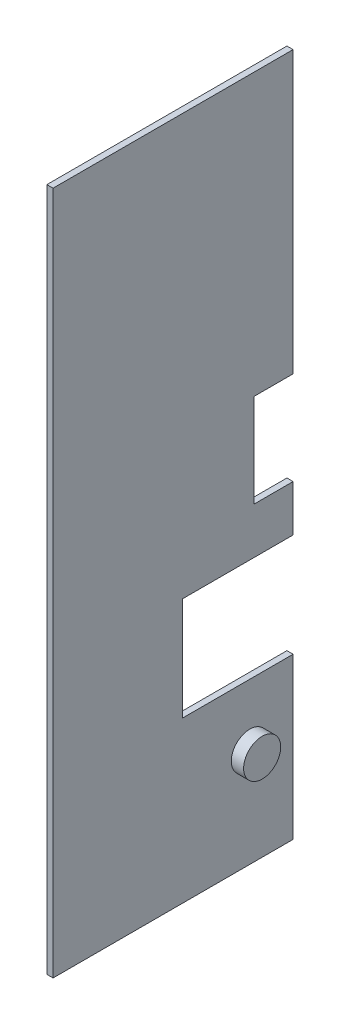
ISO-10303-21;
HEADER;
FILE_DESCRIPTION(('STEP AP214'),'2;1');
FILE_NAME('part.step','',(''),(''),'','','');
FILE_SCHEMA(('AUTOMOTIVE_DESIGN { 1 0 10303 214 1 1 1 1 }'));
ENDSEC;
DATA;
#1=APPLICATION_CONTEXT('core data for automotive mechanical design processes');
#2=APPLICATION_PROTOCOL_DEFINITION('international standard','automotive_design',2000,#1);
#3=PRODUCT_CONTEXT('',#1,'mechanical');
#4=PRODUCT('Part','Part','',(#3));
#5=PRODUCT_RELATED_PRODUCT_CATEGORY('part','',(#4));
#6=PRODUCT_DEFINITION_FORMATION('','',#4);
#7=PRODUCT_DEFINITION_CONTEXT('part definition',#1,'design');
#8=PRODUCT_DEFINITION('design','',#6,#7);
#9=PRODUCT_DEFINITION_SHAPE('','',#8);
#10=(LENGTH_UNIT() NAMED_UNIT(*) SI_UNIT(.MILLI.,.METRE.));
#11=(NAMED_UNIT(*) PLANE_ANGLE_UNIT() SI_UNIT($,.RADIAN.));
#12=(NAMED_UNIT(*) SI_UNIT($,.STERADIAN.) SOLID_ANGLE_UNIT());
#13=UNCERTAINTY_MEASURE_WITH_UNIT(LENGTH_MEASURE(1.E-05),#10,'distance_accuracy_value','');
#14=(GEOMETRIC_REPRESENTATION_CONTEXT(3) GLOBAL_UNCERTAINTY_ASSIGNED_CONTEXT((#13)) GLOBAL_UNIT_ASSIGNED_CONTEXT((#10,
#11,#12)) REPRESENTATION_CONTEXT('',''));
#15=CARTESIAN_POINT('',(0.,0.,0.));
#16=DIRECTION('',(0.,0.,1.));
#17=DIRECTION('',(1.,0.,0.));
#18=AXIS2_PLACEMENT_3D('',#15,#16,#17);
#19=CARTESIAN_POINT('',(1.,0.,0.));
#20=DIRECTION('',(-1.,0.,0.));
#21=DIRECTION('',(0.,0.,1.));
#22=AXIS2_PLACEMENT_3D('',#19,#20,#21);
#23=PLANE('',#22);
#24=CARTESIAN_POINT('',(1.,6.10997262878797,10.4104146753078));
#25=DIRECTION('',(-1.,0.,0.));
#26=DIRECTION('',(0.,0.,1.));
#27=AXIS2_PLACEMENT_3D('',#24,#25,#26);
#28=CIRCLE('',#27,1.37973862307829);
#29=CARTESIAN_POINT('',(1.,6.10997262878797,11.7901532983861));
#30=VERTEX_POINT('',#29);
#31=EDGE_CURVE('E139',#30,#30,#28,.T.);
#32=ORIENTED_EDGE('',*,*,#31,.T.);
#33=EDGE_LOOP('',(#32));
#34=FACE_BOUND('',#33,.T.);
#35=CARTESIAN_POINT('',(1.,6.10997262878797,10.4104146753078));
#36=DIRECTION('',(1.,0.,0.));
#37=DIRECTION('',(0.,0.,-1.));
#38=AXIS2_PLACEMENT_3D('',#35,#36,#37);
#39=CIRCLE('',#38,2.27350306586522);
#40=CARTESIAN_POINT('',(1.,6.10997262878797,8.1369116094426));
#41=VERTEX_POINT('',#40);
#42=EDGE_CURVE('E294',#41,#41,#39,.T.);
#43=ORIENTED_EDGE('',*,*,#42,.T.);
#44=EDGE_LOOP('',(#43));
#45=FACE_BOUND('',#44,.T.);
#46=ADVANCED_FACE('F33',(#34,#45),#23,.F.);
#47=CARTESIAN_POINT('',(1.,100.85,3.40000000000002));
#48=DIRECTION('',(0.,0.,-1.));
#49=DIRECTION('',(0.,1.,0.));
#50=AXIS2_PLACEMENT_3D('',#47,#48,#49);
#51=PLANE('',#50);
#52=DIRECTION('',(-1.,0.,0.));
#53=VECTOR('',#52,1.);
#54=CARTESIAN_POINT('',(3.,55.4012906469279,3.40000000000002));
#55=LINE('',#54,#53);
#56=CARTESIAN_POINT('',(1.,55.4012906469279,3.40000000000002));
#57=VERTEX_POINT('',#56);
#58=CARTESIAN_POINT('',(0.,55.4012906469279,3.40000000000002));
#59=VERTEX_POINT('',#58);
#60=EDGE_CURVE('E148',#57,#59,#55,.T.);
#61=ORIENTED_EDGE('',*,*,#60,.T.);
#62=DIRECTION('',(0.,-1.,0.));
#63=VECTOR('',#62,1.);
#64=CARTESIAN_POINT('',(0.,-9.84999999999989,3.40000000000002));
#65=LINE('',#64,#63);
#66=CARTESIAN_POINT('',(0.,100.85,3.40000000000002));
#67=VERTEX_POINT('',#66);
#68=EDGE_CURVE('E191',#67,#59,#65,.T.);
#69=ORIENTED_EDGE('',*,*,#68,.F.);
#70=DIRECTION('',(-1.,0.,0.));
#71=VECTOR('',#70,1.);
#72=CARTESIAN_POINT('',(1.,100.85,3.40000000000002));
#73=LINE('',#72,#71);
#74=CARTESIAN_POINT('',(1.,100.85,3.40000000000002));
#75=VERTEX_POINT('',#74);
#76=EDGE_CURVE('E214',#75,#67,#73,.T.);
#77=ORIENTED_EDGE('',*,*,#76,.F.);
#78=DIRECTION('',(0.,-1.,0.));
#79=VECTOR('',#78,1.);
#80=CARTESIAN_POINT('',(1.,100.85,3.40000000000002));
#81=LINE('',#80,#79);
#82=EDGE_CURVE('E207',#75,#57,#81,.T.);
#83=ORIENTED_EDGE('',*,*,#82,.T.);
#84=EDGE_LOOP('',(#61,#69,#77,#83));
#85=FACE_BOUND('',#84,.T.);
#86=ADVANCED_FACE('F232',(#85),#51,.T.);
#87=DIRECTION('',(-1.,0.,0.));
#88=VECTOR('',#87,1.);
#89=CARTESIAN_POINT('',(3.,40.3056784370558,3.40000000000002));
#90=LINE('',#89,#88);
#91=CARTESIAN_POINT('',(1.,40.3056784370558,3.40000000000002));
#92=VERTEX_POINT('',#91);
#93=CARTESIAN_POINT('',(0.,40.3056784370558,3.40000000000002));
#94=VERTEX_POINT('',#93);
#95=EDGE_CURVE('E48',#92,#94,#90,.T.);
#96=ORIENTED_EDGE('',*,*,#95,.F.);
#97=CARTESIAN_POINT('',(0.999999999999999,32.8158785874378,3.40000000000002));
#98=VERTEX_POINT('',#97);
#99=EDGE_CURVE('E211',#92,#98,#81,.T.);
#100=ORIENTED_EDGE('',*,*,#99,.T.);
#101=DIRECTION('',(-1.,0.,0.));
#102=VECTOR('',#101,1.);
#103=CARTESIAN_POINT('',(10.,32.8158785874378,3.40000000000002));
#104=LINE('',#103,#102);
#105=CARTESIAN_POINT('',(0.,32.8158785874378,3.40000000000002));
#106=VERTEX_POINT('',#105);
#107=EDGE_CURVE('E167',#98,#106,#104,.T.);
#108=ORIENTED_EDGE('',*,*,#107,.T.);
#109=EDGE_CURVE('E194',#94,#106,#65,.T.);
#110=ORIENTED_EDGE('',*,*,#109,.F.);
#111=EDGE_LOOP('',(#96,#100,#108,#110));
#112=FACE_BOUND('',#111,.T.);
#113=ADVANCED_FACE('F240',(#112),#51,.T.);
#114=CARTESIAN_POINT('',(1.,-9.84999999999989,3.40000000000003));
#115=DIRECTION('',(0.,-1.,0.));
#116=DIRECTION('',(0.,0.,-1.));
#117=AXIS2_PLACEMENT_3D('',#114,#115,#116);
#118=PLANE('',#117);
#119=DIRECTION('',(-1.,0.,0.));
#120=VECTOR('',#119,1.);
#121=CARTESIAN_POINT('',(1.,-9.84999999999989,42.25));
#122=LINE('',#121,#120);
#123=CARTESIAN_POINT('',(1.,-9.84999999999989,42.25));
#124=VERTEX_POINT('',#123);
#125=CARTESIAN_POINT('',(0.,-9.84999999999989,42.25));
#126=VERTEX_POINT('',#125);
#127=EDGE_CURVE('E210',#124,#126,#122,.T.);
#128=ORIENTED_EDGE('',*,*,#127,.T.);
#129=DIRECTION('',(0.,0.,1.));
#130=VECTOR('',#129,1.);
#131=CARTESIAN_POINT('',(0.,-9.84999999999989,42.25));
#132=LINE('',#131,#130);
#133=CARTESIAN_POINT('',(0.,-9.84999999999989,3.40000000000002));
#134=VERTEX_POINT('',#133);
#135=EDGE_CURVE('E193',#134,#126,#132,.T.);
#136=ORIENTED_EDGE('',*,*,#135,.F.);
#137=DIRECTION('',(-1.,0.,0.));
#138=VECTOR('',#137,1.);
#139=CARTESIAN_POINT('',(1.,-9.84999999999989,3.40000000000003));
#140=LINE('',#139,#138);
#141=CARTESIAN_POINT('',(1.,-9.84999999999989,3.40000000000003));
#142=VERTEX_POINT('',#141);
#143=EDGE_CURVE('E41',#142,#134,#140,.T.);
#144=ORIENTED_EDGE('',*,*,#143,.F.);
#145=DIRECTION('',(0.,0.,1.));
#146=VECTOR('',#145,1.);
#147=CARTESIAN_POINT('',(1.,-9.84999999999989,3.40000000000003));
#148=LINE('',#147,#146);
#149=EDGE_CURVE('E197',#142,#124,#148,.T.);
#150=ORIENTED_EDGE('',*,*,#149,.T.);
#151=EDGE_LOOP('',(#128,#136,#144,#150));
#152=FACE_BOUND('',#151,.T.);
#153=ADVANCED_FACE('F35',(#152),#118,.T.);
#154=DIRECTION('',(-1.,0.,0.));
#155=VECTOR('',#154,1.);
#156=CARTESIAN_POINT('',(10.,16.1071011738195,3.40000000000002));
#157=LINE('',#156,#155);
#158=CARTESIAN_POINT('',(0.999999999999999,16.1071011738195,3.40000000000002));
#159=VERTEX_POINT('',#158);
#160=CARTESIAN_POINT('',(0.,16.1071011738195,3.40000000000002));
#161=VERTEX_POINT('',#160);
#162=EDGE_CURVE('E56',#159,#161,#157,.T.);
#163=ORIENTED_EDGE('',*,*,#162,.F.);
#164=EDGE_CURVE('E206',#159,#142,#81,.T.);
#165=ORIENTED_EDGE('',*,*,#164,.T.);
#166=ORIENTED_EDGE('',*,*,#143,.T.);
#167=EDGE_CURVE('E190',#161,#134,#65,.T.);
#168=ORIENTED_EDGE('',*,*,#167,.F.);
#169=EDGE_LOOP('',(#163,#165,#166,#168));
#170=FACE_BOUND('',#169,.T.);
#171=ADVANCED_FACE('F251',(#170),#51,.T.);
#172=CARTESIAN_POINT('',(1.,100.85,42.25));
#173=DIRECTION('',(0.,1.,0.));
#174=DIRECTION('',(0.,0.,1.));
#175=AXIS2_PLACEMENT_3D('',#172,#173,#174);
#176=PLANE('',#175);
#177=ORIENTED_EDGE('',*,*,#76,.T.);
#178=DIRECTION('',(0.,0.,-1.));
#179=VECTOR('',#178,1.);
#180=CARTESIAN_POINT('',(0.,100.85,3.40000000000002));
#181=LINE('',#180,#179);
#182=CARTESIAN_POINT('',(0.,100.85,42.25));
#183=VERTEX_POINT('',#182);
#184=EDGE_CURVE('E187',#183,#67,#181,.T.);
#185=ORIENTED_EDGE('',*,*,#184,.F.);
#186=DIRECTION('',(-1.,0.,0.));
#187=VECTOR('',#186,1.);
#188=CARTESIAN_POINT('',(1.,100.85,42.25));
#189=LINE('',#188,#187);
#190=CARTESIAN_POINT('',(1.,100.85,42.25));
#191=VERTEX_POINT('',#190);
#192=EDGE_CURVE('E216',#191,#183,#189,.T.);
#193=ORIENTED_EDGE('',*,*,#192,.F.);
#194=DIRECTION('',(0.,0.,-1.));
#195=VECTOR('',#194,1.);
#196=CARTESIAN_POINT('',(1.,100.85,42.25));
#197=LINE('',#196,#195);
#198=EDGE_CURVE('E203',#191,#75,#197,.T.);
#199=ORIENTED_EDGE('',*,*,#198,.T.);
#200=EDGE_LOOP('',(#177,#185,#193,#199));
#201=FACE_BOUND('',#200,.T.);
#202=ADVANCED_FACE('F229',(#201),#176,.T.);
#203=CARTESIAN_POINT('',(1.,-9.84999999999989,42.25));
#204=DIRECTION('',(0.,0.,1.));
#205=DIRECTION('',(0.,-1.,0.));
#206=AXIS2_PLACEMENT_3D('',#203,#204,#205);
#207=PLANE('',#206);
#208=ORIENTED_EDGE('',*,*,#192,.T.);
#209=DIRECTION('',(0.,1.,0.));
#210=VECTOR('',#209,1.);
#211=CARTESIAN_POINT('',(0.,100.85,42.25));
#212=LINE('',#211,#210);
#213=EDGE_CURVE('E184',#126,#183,#212,.T.);
#214=ORIENTED_EDGE('',*,*,#213,.F.);
#215=ORIENTED_EDGE('',*,*,#127,.F.);
#216=DIRECTION('',(0.,1.,0.));
#217=VECTOR('',#216,1.);
#218=CARTESIAN_POINT('',(1.,-9.84999999999989,42.25));
#219=LINE('',#218,#217);
#220=EDGE_CURVE('E200',#124,#191,#219,.T.);
#221=ORIENTED_EDGE('',*,*,#220,.T.);
#222=EDGE_LOOP('',(#208,#214,#215,#221));
#223=FACE_BOUND('',#222,.T.);
#224=ADVANCED_FACE('F225',(#223),#207,.T.);
#225=CARTESIAN_POINT('',(1.,6.10997262878797,10.4104146753078));
#226=DIRECTION('',(-1.,0.,0.));
#227=DIRECTION('',(0.,0.,1.));
#228=AXIS2_PLACEMENT_3D('',#225,#226,#227);
#229=CIRCLE('',#228,3.00004301712036);
#230=CARTESIAN_POINT('',(1.,6.10997262878797,13.4104576924282));
#231=VERTEX_POINT('',#230);
#232=EDGE_CURVE('E11',#231,#231,#229,.F.);
#233=ORIENTED_EDGE('',*,*,#232,.F.);
#234=EDGE_LOOP('',(#233));
#235=FACE_BOUND('',#234,.T.);
#236=DIRECTION('',(0.,1.,0.));
#237=VECTOR('',#236,1.);
#238=CARTESIAN_POINT('',(1.,0.,9.73848540272368));
#239=LINE('',#238,#237);
#240=CARTESIAN_POINT('',(1.,40.3056784370558,9.73848540272368));
#241=VERTEX_POINT('',#240);
#242=CARTESIAN_POINT('',(1.,55.4012906469279,9.73848540272368));
#243=VERTEX_POINT('',#242);
#244=EDGE_CURVE('E131',#241,#243,#239,.T.);
#245=ORIENTED_EDGE('',*,*,#244,.T.);
#246=DIRECTION('',(0.,0.,-1.));
#247=VECTOR('',#246,1.);
#248=CARTESIAN_POINT('',(1.,55.4012906469279,0.));
#249=LINE('',#248,#247);
#250=EDGE_CURVE('E156',#243,#57,#249,.T.);
#251=ORIENTED_EDGE('',*,*,#250,.T.);
#252=ORIENTED_EDGE('',*,*,#82,.F.);
#253=ORIENTED_EDGE('',*,*,#198,.F.);
#254=ORIENTED_EDGE('',*,*,#220,.F.);
#255=ORIENTED_EDGE('',*,*,#149,.F.);
#256=ORIENTED_EDGE('',*,*,#164,.F.);
#257=DIRECTION('',(0.,0.,1.));
#258=VECTOR('',#257,1.);
#259=CARTESIAN_POINT('',(1.,16.1071011738195,0.));
#260=LINE('',#259,#258);
#261=CARTESIAN_POINT('',(0.999999999999999,16.1071011738195,21.3328270470195));
#262=VERTEX_POINT('',#261);
#263=EDGE_CURVE('E170',#159,#262,#260,.T.);
#264=ORIENTED_EDGE('',*,*,#263,.T.);
#265=DIRECTION('',(0.,1.,0.));
#266=VECTOR('',#265,1.);
#267=CARTESIAN_POINT('',(1.,0.,21.3328270470195));
#268=LINE('',#267,#266);
#269=CARTESIAN_POINT('',(0.999999999999999,32.8158785874378,21.3328270470195));
#270=VERTEX_POINT('',#269);
#271=EDGE_CURVE('E178',#262,#270,#268,.T.);
#272=ORIENTED_EDGE('',*,*,#271,.T.);
#273=DIRECTION('',(0.,0.,-1.));
#274=VECTOR('',#273,1.);
#275=CARTESIAN_POINT('',(1.,32.8158785874378,0.));
#276=LINE('',#275,#274);
#277=EDGE_CURVE('E181',#270,#98,#276,.T.);
#278=ORIENTED_EDGE('',*,*,#277,.T.);
#279=ORIENTED_EDGE('',*,*,#99,.F.);
#280=DIRECTION('',(0.,0.,1.));
#281=VECTOR('',#280,1.);
#282=CARTESIAN_POINT('',(1.,40.3056784370558,0.));
#283=LINE('',#282,#281);
#284=EDGE_CURVE('E151',#92,#241,#283,.T.);
#285=ORIENTED_EDGE('',*,*,#284,.T.);
#286=EDGE_LOOP('',(#245,#251,#252,#253,#254,#255,#256,#264,#272,#278,#279,#285));
#287=FACE_BOUND('',#286,.T.);
#288=ADVANCED_FACE('F237',(#235,#287),#23,.F.);
#289=CARTESIAN_POINT('',(0.,0.,0.));
#290=DIRECTION('',(1.,0.,0.));
#291=DIRECTION('',(0.,0.,-1.));
#292=AXIS2_PLACEMENT_3D('',#289,#290,#291);
#293=PLANE('',#292);
#294=CARTESIAN_POINT('',(0.,6.10997262878797,10.4104146753078));
#295=DIRECTION('',(-1.,0.,0.));
#296=DIRECTION('',(0.,0.,1.));
#297=AXIS2_PLACEMENT_3D('',#294,#295,#296);
#298=CIRCLE('',#297,1.37973862307829);
#299=CARTESIAN_POINT('',(0.,6.10997262878797,11.7901532983861));
#300=VERTEX_POINT('',#299);
#301=EDGE_CURVE('E299',#300,#300,#298,.T.);
#302=ORIENTED_EDGE('',*,*,#301,.F.);
#303=EDGE_LOOP('',(#302));
#304=FACE_BOUND('',#303,.T.);
#305=ORIENTED_EDGE('',*,*,#68,.T.);
#306=DIRECTION('',(0.,0.,-1.));
#307=VECTOR('',#306,1.);
#308=CARTESIAN_POINT('',(0.,55.4012906469279,3.40000000000002));
#309=LINE('',#308,#307);
#310=CARTESIAN_POINT('',(0.,55.4012906469279,9.73848540272368));
#311=VERTEX_POINT('',#310);
#312=EDGE_CURVE('E143',#311,#59,#309,.T.);
#313=ORIENTED_EDGE('',*,*,#312,.F.);
#314=DIRECTION('',(0.,1.,0.));
#315=VECTOR('',#314,1.);
#316=CARTESIAN_POINT('',(0.,55.4012906469279,9.73848540272368));
#317=LINE('',#316,#315);
#318=CARTESIAN_POINT('',(0.,40.3056784370558,9.73848540272368));
#319=VERTEX_POINT('',#318);
#320=EDGE_CURVE('E128',#319,#311,#317,.T.);
#321=ORIENTED_EDGE('',*,*,#320,.F.);
#322=DIRECTION('',(0.,0.,1.));
#323=VECTOR('',#322,1.);
#324=CARTESIAN_POINT('',(0.,40.3056784370558,3.40000000000002));
#325=LINE('',#324,#323);
#326=EDGE_CURVE('E135',#94,#319,#325,.T.);
#327=ORIENTED_EDGE('',*,*,#326,.F.);
#328=ORIENTED_EDGE('',*,*,#109,.T.);
#329=DIRECTION('',(0.,0.,-1.));
#330=VECTOR('',#329,1.);
#331=CARTESIAN_POINT('',(0.,32.8158785874378,3.40000000000002));
#332=LINE('',#331,#330);
#333=CARTESIAN_POINT('',(0.,32.8158785874378,21.3328270470195));
#334=VERTEX_POINT('',#333);
#335=EDGE_CURVE('E164',#334,#106,#332,.T.);
#336=ORIENTED_EDGE('',*,*,#335,.F.);
#337=DIRECTION('',(0.,1.,0.));
#338=VECTOR('',#337,1.);
#339=CARTESIAN_POINT('',(0.,32.8158785874378,21.3328270470195));
#340=LINE('',#339,#338);
#341=CARTESIAN_POINT('',(0.,16.1071011738195,21.3328270470195));
#342=VERTEX_POINT('',#341);
#343=EDGE_CURVE('E161',#342,#334,#340,.T.);
#344=ORIENTED_EDGE('',*,*,#343,.F.);
#345=DIRECTION('',(0.,0.,1.));
#346=VECTOR('',#345,1.);
#347=CARTESIAN_POINT('',(0.,16.1071011738195,3.40000000000002));
#348=LINE('',#347,#346);
#349=EDGE_CURVE('E159',#161,#342,#348,.T.);
#350=ORIENTED_EDGE('',*,*,#349,.F.);
#351=ORIENTED_EDGE('',*,*,#167,.T.);
#352=ORIENTED_EDGE('',*,*,#135,.T.);
#353=ORIENTED_EDGE('',*,*,#213,.T.);
#354=ORIENTED_EDGE('',*,*,#184,.T.);
#355=EDGE_LOOP('',(#305,#313,#321,#327,#328,#336,#344,#350,#351,#352,#353,#354));
#356=FACE_BOUND('',#355,.T.);
#357=ADVANCED_FACE('F142',(#304,#356),#293,.F.);
#358=CARTESIAN_POINT('',(10.,32.8158785874378,3.40000000000002));
#359=DIRECTION('',(0.,1.,0.));
#360=DIRECTION('',(0.,0.,1.));
#361=AXIS2_PLACEMENT_3D('',#358,#359,#360);
#362=PLANE('',#361);
#363=DIRECTION('',(-1.,0.,0.));
#364=VECTOR('',#363,1.);
#365=CARTESIAN_POINT('',(10.,32.8158785874378,21.3328270470195));
#366=LINE('',#365,#364);
#367=EDGE_CURVE('E171',#270,#334,#366,.T.);
#368=ORIENTED_EDGE('',*,*,#367,.T.);
#369=ORIENTED_EDGE('',*,*,#335,.T.);
#370=ORIENTED_EDGE('',*,*,#107,.F.);
#371=ORIENTED_EDGE('',*,*,#277,.F.);
#372=EDGE_LOOP('',(#368,#369,#370,#371));
#373=FACE_BOUND('',#372,.T.);
#374=ADVANCED_FACE('F245',(#373),#362,.F.);
#375=CARTESIAN_POINT('',(10.,32.8158785874378,21.3328270470195));
#376=DIRECTION('',(0.,0.,1.));
#377=DIRECTION('',(0.,-1.,0.));
#378=AXIS2_PLACEMENT_3D('',#375,#376,#377);
#379=PLANE('',#378);
#380=DIRECTION('',(-1.,0.,0.));
#381=VECTOR('',#380,1.);
#382=CARTESIAN_POINT('',(10.,16.1071011738195,21.3328270470195));
#383=LINE('',#382,#381);
#384=EDGE_CURVE('E173',#262,#342,#383,.T.);
#385=ORIENTED_EDGE('',*,*,#384,.T.);
#386=ORIENTED_EDGE('',*,*,#343,.T.);
#387=ORIENTED_EDGE('',*,*,#367,.F.);
#388=ORIENTED_EDGE('',*,*,#271,.F.);
#389=EDGE_LOOP('',(#385,#386,#387,#388));
#390=FACE_BOUND('',#389,.T.);
#391=ADVANCED_FACE('F248',(#390),#379,.F.);
#392=CARTESIAN_POINT('',(10.,16.1071011738195,3.40000000000002));
#393=DIRECTION('',(0.,-1.,0.));
#394=DIRECTION('',(0.,0.,-1.));
#395=AXIS2_PLACEMENT_3D('',#392,#393,#394);
#396=PLANE('',#395);
#397=ORIENTED_EDGE('',*,*,#162,.T.);
#398=ORIENTED_EDGE('',*,*,#349,.T.);
#399=ORIENTED_EDGE('',*,*,#384,.F.);
#400=ORIENTED_EDGE('',*,*,#263,.F.);
#401=EDGE_LOOP('',(#397,#398,#399,#400));
#402=FACE_BOUND('',#401,.T.);
#403=ADVANCED_FACE('F253',(#402),#396,.F.);
#404=CARTESIAN_POINT('',(3.,55.4012906469279,3.40000000000002));
#405=DIRECTION('',(0.,1.,0.));
#406=DIRECTION('',(0.,0.,1.));
#407=AXIS2_PLACEMENT_3D('',#404,#405,#406);
#408=PLANE('',#407);
#409=DIRECTION('',(-1.,0.,0.));
#410=VECTOR('',#409,1.);
#411=CARTESIAN_POINT('',(3.,55.4012906469279,9.73848540272368));
#412=LINE('',#411,#410);
#413=EDGE_CURVE('E133',#243,#311,#412,.T.);
#414=ORIENTED_EDGE('',*,*,#413,.T.);
#415=ORIENTED_EDGE('',*,*,#312,.T.);
#416=ORIENTED_EDGE('',*,*,#60,.F.);
#417=ORIENTED_EDGE('',*,*,#250,.F.);
#418=EDGE_LOOP('',(#414,#415,#416,#417));
#419=FACE_BOUND('',#418,.T.);
#420=ADVANCED_FACE('F235',(#419),#408,.F.);
#421=CARTESIAN_POINT('',(3.,55.4012906469279,9.73848540272368));
#422=DIRECTION('',(0.,0.,1.));
#423=DIRECTION('',(1.,0.,0.));
#424=AXIS2_PLACEMENT_3D('',#421,#422,#423);
#425=PLANE('',#424);
#426=DIRECTION('',(-1.,0.,0.));
#427=VECTOR('',#426,1.);
#428=CARTESIAN_POINT('',(3.,40.3056784370558,9.73848540272368));
#429=LINE('',#428,#427);
#430=EDGE_CURVE('E124',#241,#319,#429,.T.);
#431=ORIENTED_EDGE('',*,*,#430,.T.);
#432=ORIENTED_EDGE('',*,*,#320,.T.);
#433=ORIENTED_EDGE('',*,*,#413,.F.);
#434=ORIENTED_EDGE('',*,*,#244,.F.);
#435=EDGE_LOOP('',(#431,#432,#433,#434));
#436=FACE_BOUND('',#435,.T.);
#437=ADVANCED_FACE('F125',(#436),#425,.F.);
#438=CARTESIAN_POINT('',(3.,40.3056784370558,3.40000000000002));
#439=DIRECTION('',(0.,-1.,0.));
#440=DIRECTION('',(0.,0.,-1.));
#441=AXIS2_PLACEMENT_3D('',#438,#439,#440);
#442=PLANE('',#441);
#443=ORIENTED_EDGE('',*,*,#95,.T.);
#444=ORIENTED_EDGE('',*,*,#326,.T.);
#445=ORIENTED_EDGE('',*,*,#430,.F.);
#446=ORIENTED_EDGE('',*,*,#284,.F.);
#447=EDGE_LOOP('',(#443,#444,#445,#446));
#448=FACE_BOUND('',#447,.T.);
#449=ADVANCED_FACE('F136',(#448),#442,.F.);
#450=CARTESIAN_POINT('',(3.,6.10997262878797,10.4104146753078));
#451=DIRECTION('',(-1.,0.,0.));
#452=DIRECTION('',(0.,0.,1.));
#453=AXIS2_PLACEMENT_3D('',#450,#451,#452);
#454=CYLINDRICAL_SURFACE('',#453,1.37973862307829);
#455=ORIENTED_EDGE('',*,*,#301,.T.);
#456=EDGE_LOOP('',(#455));
#457=FACE_BOUND('',#456,.T.);
#458=ORIENTED_EDGE('',*,*,#31,.F.);
#459=EDGE_LOOP('',(#458));
#460=FACE_BOUND('',#459,.T.);
#461=ADVANCED_FACE('F285',(#457,#460),#454,.F.);
#462=CARTESIAN_POINT('',(2.,6.10997262878797,10.4104146753078));
#463=DIRECTION('',(-1.,0.,0.));
#464=DIRECTION('',(0.,0.,1.));
#465=AXIS2_PLACEMENT_3D('',#462,#463,#464);
#466=CYLINDRICAL_SURFACE('',#465,3.00004301712036);
#467=ORIENTED_EDGE('',*,*,#232,.T.);
#468=EDGE_LOOP('',(#467));
#469=FACE_BOUND('',#468,.T.);
#470=CARTESIAN_POINT('',(3.,6.10997262878797,10.4104146753078));
#471=DIRECTION('',(1.,0.,0.));
#472=DIRECTION('',(0.,0.,-1.));
#473=AXIS2_PLACEMENT_3D('',#470,#471,#472);
#474=CIRCLE('',#473,3.00004301712036);
#475=CARTESIAN_POINT('',(3.,6.10997262878797,7.41037165818746));
#476=VERTEX_POINT('',#475);
#477=EDGE_CURVE('E289',#476,#476,#474,.T.);
#478=ORIENTED_EDGE('',*,*,#477,.F.);
#479=EDGE_LOOP('',(#478));
#480=FACE_BOUND('',#479,.T.);
#481=ADVANCED_FACE('F281',(#469,#480),#466,.T.);
#482=CARTESIAN_POINT('',(2.,6.10997262878797,10.4104146753078));
#483=DIRECTION('',(-1.,0.,0.));
#484=DIRECTION('',(0.,0.,1.));
#485=AXIS2_PLACEMENT_3D('',#482,#483,#484);
#486=CYLINDRICAL_SURFACE('',#485,2.27350306586522);
#487=CARTESIAN_POINT('',(2.,6.10997262878797,10.4104146753078));
#488=DIRECTION('',(1.,0.,0.));
#489=DIRECTION('',(0.,0.,-1.));
#490=AXIS2_PLACEMENT_3D('',#487,#488,#489);
#491=CIRCLE('',#490,2.27350306586522);
#492=CARTESIAN_POINT('',(2.,6.10997262878797,8.1369116094426));
#493=VERTEX_POINT('',#492);
#494=EDGE_CURVE('E291',#493,#493,#491,.T.);
#495=ORIENTED_EDGE('',*,*,#494,.T.);
#496=EDGE_LOOP('',(#495));
#497=FACE_BOUND('',#496,.T.);
#498=ORIENTED_EDGE('',*,*,#42,.F.);
#499=EDGE_LOOP('',(#498));
#500=FACE_BOUND('',#499,.T.);
#501=ADVANCED_FACE('F284',(#497,#500),#486,.F.);
#502=CARTESIAN_POINT('',(2.,6.10997262878797,10.4104146753078));
#503=DIRECTION('',(1.,0.,0.));
#504=DIRECTION('',(0.,0.,-1.));
#505=AXIS2_PLACEMENT_3D('',#502,#503,#504);
#506=PLANE('',#505);
#507=ORIENTED_EDGE('',*,*,#494,.F.);
#508=EDGE_LOOP('',(#507));
#509=FACE_BOUND('',#508,.T.);
#510=ADVANCED_FACE('F391',(#509),#506,.F.);
#511=CARTESIAN_POINT('',(3.,6.10997262878797,10.4104146753078));
#512=DIRECTION('',(1.,0.,0.));
#513=DIRECTION('',(0.,0.,-1.));
#514=AXIS2_PLACEMENT_3D('',#511,#512,#513);
#515=PLANE('',#514);
#516=ORIENTED_EDGE('',*,*,#477,.T.);
#517=EDGE_LOOP('',(#516));
#518=FACE_BOUND('',#517,.T.);
#519=ADVANCED_FACE('F406',(#518),#515,.T.);
#520=CLOSED_SHELL('',(#46,#86,#113,#153,#171,#202,#224,#288,#357,#374,#391,#403,#420,#437,#449,
#461,#481,#501,#510,#519));
#521=MANIFOLD_SOLID_BREP('B2',#520);
#522=ADVANCED_BREP_SHAPE_REPRESENTATION('',(#18,#521),#14);
#523=SHAPE_DEFINITION_REPRESENTATION(#9,#522);
ENDSEC;
END-ISO-10303-21;
